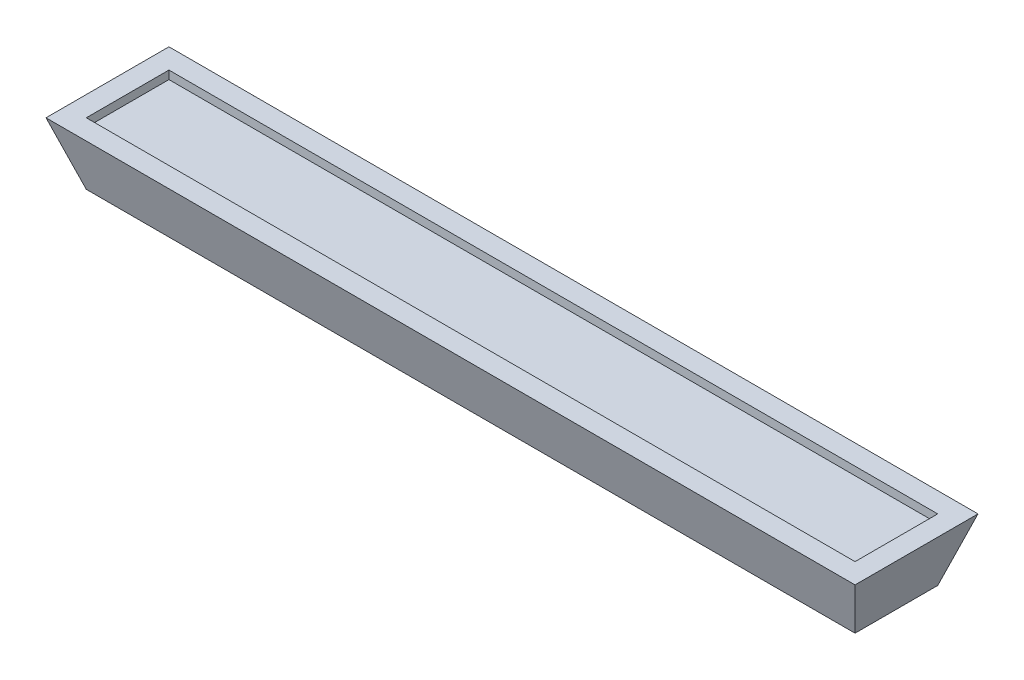
ISO-10303-21;
HEADER;
FILE_DESCRIPTION(('STEP AP214'),'2;1');
FILE_NAME('part.step','',(''),(''),'','','');
FILE_SCHEMA(('AUTOMOTIVE_DESIGN { 1 0 10303 214 1 1 1 1 }'));
ENDSEC;
DATA;
#1=APPLICATION_CONTEXT('core data for automotive mechanical design processes');
#2=APPLICATION_PROTOCOL_DEFINITION('international standard','automotive_design',2000,#1);
#3=PRODUCT_CONTEXT('',#1,'mechanical');
#4=PRODUCT('Part','Part','',(#3));
#5=PRODUCT_RELATED_PRODUCT_CATEGORY('part','',(#4));
#6=PRODUCT_DEFINITION_FORMATION('','',#4);
#7=PRODUCT_DEFINITION_CONTEXT('part definition',#1,'design');
#8=PRODUCT_DEFINITION('design','',#6,#7);
#9=PRODUCT_DEFINITION_SHAPE('','',#8);
#10=(LENGTH_UNIT() NAMED_UNIT(*) SI_UNIT(.MILLI.,.METRE.));
#11=(NAMED_UNIT(*) PLANE_ANGLE_UNIT() SI_UNIT($,.RADIAN.));
#12=(NAMED_UNIT(*) SI_UNIT($,.STERADIAN.) SOLID_ANGLE_UNIT());
#13=UNCERTAINTY_MEASURE_WITH_UNIT(LENGTH_MEASURE(1.E-05),#10,'distance_accuracy_value','');
#14=(GEOMETRIC_REPRESENTATION_CONTEXT(3) GLOBAL_UNCERTAINTY_ASSIGNED_CONTEXT((#13)) GLOBAL_UNIT_ASSIGNED_CONTEXT((#10,
#11,#12)) REPRESENTATION_CONTEXT('',''));
#15=CARTESIAN_POINT('',(0.,0.,0.));
#16=DIRECTION('',(0.,0.,1.));
#17=DIRECTION('',(1.,0.,0.));
#18=AXIS2_PLACEMENT_3D('',#15,#16,#17);
#19=CARTESIAN_POINT('',(93.,0.,-10.));
#20=DIRECTION('',(0.951056516295153,-0.309016994374948,0.));
#21=DIRECTION('',(0.309016994374948,0.951056516295154,0.));
#22=AXIS2_PLACEMENT_3D('',#19,#20,#21);
#23=PLANE('',#22);
#24=DIRECTION('',(0.,0.,-1.));
#25=VECTOR('',#24,1.);
#26=CARTESIAN_POINT('',(93.,0.,-10.));
#27=LINE('',#26,#25);
#28=CARTESIAN_POINT('',(93.,0.,10.));
#29=VERTEX_POINT('',#28);
#30=CARTESIAN_POINT('',(93.,0.,-10.));
#31=VERTEX_POINT('',#30);
#32=EDGE_CURVE('E219',#29,#31,#27,.T.);
#33=ORIENTED_EDGE('',*,*,#32,.T.);
#34=DIRECTION('',(-0.295241808844327,-0.908660854566026,0.295241808844327));
#35=VECTOR('',#34,1.);
#36=CARTESIAN_POINT('',(76.7868030217214,-49.8990894250276,6.21319697827863));
#37=LINE('',#36,#35);
#38=CARTESIAN_POINT('',(97.8737954434936,15.,-14.8737954434936));
#39=VERTEX_POINT('',#38);
#40=EDGE_CURVE('E11',#39,#31,#37,.T.);
#41=ORIENTED_EDGE('',*,*,#40,.F.);
#42=DIRECTION('',(0.,0.,1.));
#43=VECTOR('',#42,1.);
#44=CARTESIAN_POINT('',(97.8737954434936,15.,-10.));
#45=LINE('',#44,#43);
#46=CARTESIAN_POINT('',(97.8737954434936,15.,14.8737954434936));
#47=VERTEX_POINT('',#46);
#48=EDGE_CURVE('E239',#47,#39,#45,.F.);
#49=ORIENTED_EDGE('',*,*,#48,.F.);
#50=DIRECTION('',(-0.295241808844327,-0.908660854566026,-0.295241808844327));
#51=VECTOR('',#50,1.);
#52=CARTESIAN_POINT('',(91.2566454862066,-5.36549348656211,8.2566454862066));
#53=LINE('',#52,#51);
#54=EDGE_CURVE('E241',#47,#29,#53,.T.);
#55=ORIENTED_EDGE('',*,*,#54,.T.);
#56=EDGE_LOOP('',(#33,#41,#49,#55));
#57=FACE_BOUND('',#56,.T.);
#58=ADVANCED_FACE('F39',(#57),#23,.T.);
#59=CARTESIAN_POINT('',(-93.,0.,-10.));
#60=DIRECTION('',(0.,-0.309016994374948,-0.951056516295153));
#61=DIRECTION('',(0.,0.951056516295153,-0.309016994374948));
#62=AXIS2_PLACEMENT_3D('',#59,#60,#61);
#63=PLANE('',#62);
#64=DIRECTION('',(-1.,0.,0.));
#65=VECTOR('',#64,1.);
#66=CARTESIAN_POINT('',(-93.,0.,-10.));
#67=LINE('',#66,#65);
#68=CARTESIAN_POINT('',(-93.,0.,-10.));
#69=VERTEX_POINT('',#68);
#70=EDGE_CURVE('E231',#31,#69,#67,.T.);
#71=ORIENTED_EDGE('',*,*,#70,.T.);
#72=DIRECTION('',(0.295241808844327,-0.908660854566026,0.295241808844327));
#73=VECTOR('',#72,1.);
#74=CARTESIAN_POINT('',(-93.,0.,-10.));
#75=LINE('',#74,#73);
#76=CARTESIAN_POINT('',(-97.8737954434936,15.,-14.8737954434936));
#77=VERTEX_POINT('',#76);
#78=EDGE_CURVE('E49',#77,#69,#75,.T.);
#79=ORIENTED_EDGE('',*,*,#78,.F.);
#80=DIRECTION('',(1.,0.,0.));
#81=VECTOR('',#80,1.);
#82=CARTESIAN_POINT('',(-93.,15.,-14.8737954434936));
#83=LINE('',#82,#81);
#84=EDGE_CURVE('E255',#39,#77,#83,.F.);
#85=ORIENTED_EDGE('',*,*,#84,.F.);
#86=ORIENTED_EDGE('',*,*,#40,.T.);
#87=EDGE_LOOP('',(#71,#79,#85,#86));
#88=FACE_BOUND('',#87,.T.);
#89=ADVANCED_FACE('F41',(#88),#63,.T.);
#90=CARTESIAN_POINT('',(-93.,0.,-10.));
#91=DIRECTION('',(-0.951056516295153,-0.309016994374948,0.));
#92=DIRECTION('',(0.309016994374948,-0.951056516295154,0.));
#93=AXIS2_PLACEMENT_3D('',#90,#91,#92);
#94=PLANE('',#93);
#95=DIRECTION('',(0.,0.,1.));
#96=VECTOR('',#95,1.);
#97=CARTESIAN_POINT('',(-93.,0.,-10.));
#98=LINE('',#97,#96);
#99=CARTESIAN_POINT('',(-93.,0.,10.));
#100=VERTEX_POINT('',#99);
#101=EDGE_CURVE('E234',#69,#100,#98,.T.);
#102=ORIENTED_EDGE('',*,*,#101,.T.);
#103=DIRECTION('',(0.295241808844327,-0.908660854566026,-0.295241808844327));
#104=VECTOR('',#103,1.);
#105=CARTESIAN_POINT('',(-93.,0.,10.));
#106=LINE('',#105,#104);
#107=CARTESIAN_POINT('',(-97.8737954434936,15.,14.8737954434936));
#108=VERTEX_POINT('',#107);
#109=EDGE_CURVE('E245',#108,#100,#106,.T.);
#110=ORIENTED_EDGE('',*,*,#109,.F.);
#111=DIRECTION('',(0.,0.,-1.));
#112=VECTOR('',#111,1.);
#113=CARTESIAN_POINT('',(-97.8737954434936,15.,-10.));
#114=LINE('',#113,#112);
#115=EDGE_CURVE('E257',#77,#108,#114,.F.);
#116=ORIENTED_EDGE('',*,*,#115,.F.);
#117=ORIENTED_EDGE('',*,*,#78,.T.);
#118=EDGE_LOOP('',(#102,#110,#116,#117));
#119=FACE_BOUND('',#118,.T.);
#120=ADVANCED_FACE('F277',(#119),#94,.T.);
#121=CARTESIAN_POINT('',(-93.,0.,10.));
#122=DIRECTION('',(0.,-0.309016994374948,0.951056516295153));
#123=DIRECTION('',(0.,-0.951056516295153,-0.309016994374948));
#124=AXIS2_PLACEMENT_3D('',#121,#122,#123);
#125=PLANE('',#124);
#126=DIRECTION('',(1.,0.,0.));
#127=VECTOR('',#126,1.);
#128=CARTESIAN_POINT('',(-93.,0.,10.));
#129=LINE('',#128,#127);
#130=EDGE_CURVE('E237',#100,#29,#129,.T.);
#131=ORIENTED_EDGE('',*,*,#130,.T.);
#132=ORIENTED_EDGE('',*,*,#54,.F.);
#133=DIRECTION('',(-1.,0.,0.));
#134=VECTOR('',#133,1.);
#135=CARTESIAN_POINT('',(-93.,15.,14.8737954434936));
#136=LINE('',#135,#134);
#137=EDGE_CURVE('E43',#108,#47,#136,.F.);
#138=ORIENTED_EDGE('',*,*,#137,.F.);
#139=ORIENTED_EDGE('',*,*,#109,.T.);
#140=EDGE_LOOP('',(#131,#132,#138,#139));
#141=FACE_BOUND('',#140,.T.);
#142=ADVANCED_FACE('F269',(#141),#125,.T.);
#143=CARTESIAN_POINT('',(0.,15.,0.));
#144=DIRECTION('',(0.,1.,0.));
#145=DIRECTION('',(0.,0.,1.));
#146=AXIS2_PLACEMENT_3D('',#143,#144,#145);
#147=PLANE('',#146);
#148=DIRECTION('',(0.,0.,-1.));
#149=VECTOR('',#148,1.);
#150=CARTESIAN_POINT('',(93.,15.,-10.));
#151=LINE('',#150,#149);
#152=CARTESIAN_POINT('',(93.,15.,10.));
#153=VERTEX_POINT('',#152);
#154=CARTESIAN_POINT('',(93.,15.,-10.));
#155=VERTEX_POINT('',#154);
#156=EDGE_CURVE('E65',#153,#155,#151,.T.);
#157=ORIENTED_EDGE('',*,*,#156,.F.);
#158=DIRECTION('',(1.,0.,0.));
#159=VECTOR('',#158,1.);
#160=CARTESIAN_POINT('',(-93.,15.,10.));
#161=LINE('',#160,#159);
#162=CARTESIAN_POINT('',(-93.,15.,10.));
#163=VERTEX_POINT('',#162);
#164=EDGE_CURVE('E190',#163,#153,#161,.T.);
#165=ORIENTED_EDGE('',*,*,#164,.F.);
#166=DIRECTION('',(0.,0.,1.));
#167=VECTOR('',#166,1.);
#168=CARTESIAN_POINT('',(-93.,15.,-10.));
#169=LINE('',#168,#167);
#170=CARTESIAN_POINT('',(-93.,15.,-10.));
#171=VERTEX_POINT('',#170);
#172=EDGE_CURVE('E209',#171,#163,#169,.T.);
#173=ORIENTED_EDGE('',*,*,#172,.F.);
#174=DIRECTION('',(-1.,0.,0.));
#175=VECTOR('',#174,1.);
#176=CARTESIAN_POINT('',(-93.,15.,-10.));
#177=LINE('',#176,#175);
#178=EDGE_CURVE('E205',#155,#171,#177,.T.);
#179=ORIENTED_EDGE('',*,*,#178,.F.);
#180=EDGE_LOOP('',(#157,#165,#173,#179));
#181=FACE_BOUND('',#180,.T.);
#182=ORIENTED_EDGE('',*,*,#48,.T.);
#183=ORIENTED_EDGE('',*,*,#84,.T.);
#184=ORIENTED_EDGE('',*,*,#115,.T.);
#185=ORIENTED_EDGE('',*,*,#137,.T.);
#186=EDGE_LOOP('',(#182,#183,#184,#185));
#187=FACE_BOUND('',#186,.T.);
#188=ADVANCED_FACE('F265',(#181,#187),#147,.T.);
#189=CARTESIAN_POINT('',(0.,0.,0.));
#190=DIRECTION('',(0.,1.,0.));
#191=DIRECTION('',(0.,0.,1.));
#192=AXIS2_PLACEMENT_3D('',#189,#190,#191);
#193=PLANE('',#192);
#194=DIRECTION('',(-1.,0.,0.));
#195=VECTOR('',#194,1.);
#196=CARTESIAN_POINT('',(-88.5,0.,6.5));
#197=LINE('',#196,#195);
#198=CARTESIAN_POINT('',(88.5,0.,6.5));
#199=VERTEX_POINT('',#198);
#200=CARTESIAN_POINT('',(-88.5,0.,6.5));
#201=VERTEX_POINT('',#200);
#202=EDGE_CURVE('E170',#199,#201,#197,.T.);
#203=ORIENTED_EDGE('',*,*,#202,.F.);
#204=DIRECTION('',(0.,0.,1.));
#205=VECTOR('',#204,1.);
#206=CARTESIAN_POINT('',(88.5,0.,6.5));
#207=LINE('',#206,#205);
#208=CARTESIAN_POINT('',(88.5,0.,-6.5));
#209=VERTEX_POINT('',#208);
#210=EDGE_CURVE('E57',#209,#199,#207,.T.);
#211=ORIENTED_EDGE('',*,*,#210,.F.);
#212=DIRECTION('',(1.,0.,0.));
#213=VECTOR('',#212,1.);
#214=CARTESIAN_POINT('',(-88.5,0.,-6.5));
#215=LINE('',#214,#213);
#216=CARTESIAN_POINT('',(-88.5,0.,-6.5));
#217=VERTEX_POINT('',#216);
#218=EDGE_CURVE('E154',#217,#209,#215,.T.);
#219=ORIENTED_EDGE('',*,*,#218,.F.);
#220=DIRECTION('',(0.,0.,-1.));
#221=VECTOR('',#220,1.);
#222=CARTESIAN_POINT('',(-88.5,0.,6.5));
#223=LINE('',#222,#221);
#224=EDGE_CURVE('E158',#201,#217,#223,.T.);
#225=ORIENTED_EDGE('',*,*,#224,.F.);
#226=EDGE_LOOP('',(#203,#211,#219,#225));
#227=FACE_BOUND('',#226,.T.);
#228=ORIENTED_EDGE('',*,*,#32,.F.);
#229=ORIENTED_EDGE('',*,*,#130,.F.);
#230=ORIENTED_EDGE('',*,*,#101,.F.);
#231=ORIENTED_EDGE('',*,*,#70,.F.);
#232=EDGE_LOOP('',(#228,#229,#230,#231));
#233=FACE_BOUND('',#232,.T.);
#234=ADVANCED_FACE('F279',(#227,#233),#193,.F.);
#235=CARTESIAN_POINT('',(93.,13.,-10.));
#236=DIRECTION('',(1.,0.,0.));
#237=DIRECTION('',(0.,0.,-1.));
#238=AXIS2_PLACEMENT_3D('',#235,#236,#237);
#239=PLANE('',#238);
#240=ORIENTED_EDGE('',*,*,#156,.T.);
#241=DIRECTION('',(0.,1.,0.));
#242=VECTOR('',#241,1.);
#243=CARTESIAN_POINT('',(93.,13.,-10.));
#244=LINE('',#243,#242);
#245=CARTESIAN_POINT('',(93.,13.,-10.));
#246=VERTEX_POINT('',#245);
#247=EDGE_CURVE('E202',#246,#155,#244,.T.);
#248=ORIENTED_EDGE('',*,*,#247,.F.);
#249=DIRECTION('',(0.,0.,-1.));
#250=VECTOR('',#249,1.);
#251=CARTESIAN_POINT('',(93.,13.,-10.));
#252=LINE('',#251,#250);
#253=CARTESIAN_POINT('',(93.,13.,10.));
#254=VERTEX_POINT('',#253);
#255=EDGE_CURVE('E185',#254,#246,#252,.T.);
#256=ORIENTED_EDGE('',*,*,#255,.F.);
#257=DIRECTION('',(0.,1.,0.));
#258=VECTOR('',#257,1.);
#259=CARTESIAN_POINT('',(93.,13.,10.));
#260=LINE('',#259,#258);
#261=EDGE_CURVE('E216',#254,#153,#260,.T.);
#262=ORIENTED_EDGE('',*,*,#261,.T.);
#263=EDGE_LOOP('',(#240,#248,#256,#262));
#264=FACE_BOUND('',#263,.T.);
#265=ADVANCED_FACE('F281',(#264),#239,.F.);
#266=CARTESIAN_POINT('',(-93.,13.,10.));
#267=DIRECTION('',(0.,0.,1.));
#268=DIRECTION('',(1.,0.,0.));
#269=AXIS2_PLACEMENT_3D('',#266,#267,#268);
#270=PLANE('',#269);
#271=ORIENTED_EDGE('',*,*,#164,.T.);
#272=ORIENTED_EDGE('',*,*,#261,.F.);
#273=DIRECTION('',(1.,0.,0.));
#274=VECTOR('',#273,1.);
#275=CARTESIAN_POINT('',(-93.,13.,10.));
#276=LINE('',#275,#274);
#277=CARTESIAN_POINT('',(-93.,13.,10.));
#278=VERTEX_POINT('',#277);
#279=EDGE_CURVE('E198',#278,#254,#276,.T.);
#280=ORIENTED_EDGE('',*,*,#279,.F.);
#281=DIRECTION('',(0.,1.,0.));
#282=VECTOR('',#281,1.);
#283=CARTESIAN_POINT('',(-93.,13.,10.));
#284=LINE('',#283,#282);
#285=EDGE_CURVE('E220',#278,#163,#284,.T.);
#286=ORIENTED_EDGE('',*,*,#285,.T.);
#287=EDGE_LOOP('',(#271,#272,#280,#286));
#288=FACE_BOUND('',#287,.T.);
#289=ADVANCED_FACE('F288',(#288),#270,.F.);
#290=CARTESIAN_POINT('',(-93.,13.,-10.));
#291=DIRECTION('',(-1.,0.,0.));
#292=DIRECTION('',(0.,0.,1.));
#293=AXIS2_PLACEMENT_3D('',#290,#291,#292);
#294=PLANE('',#293);
#295=ORIENTED_EDGE('',*,*,#172,.T.);
#296=ORIENTED_EDGE('',*,*,#285,.F.);
#297=DIRECTION('',(0.,0.,1.));
#298=VECTOR('',#297,1.);
#299=CARTESIAN_POINT('',(-93.,13.,-10.));
#300=LINE('',#299,#298);
#301=CARTESIAN_POINT('',(-93.,13.,-10.));
#302=VERTEX_POINT('',#301);
#303=EDGE_CURVE('E194',#302,#278,#300,.T.);
#304=ORIENTED_EDGE('',*,*,#303,.F.);
#305=DIRECTION('',(0.,1.,0.));
#306=VECTOR('',#305,1.);
#307=CARTESIAN_POINT('',(-93.,13.,-10.));
#308=LINE('',#307,#306);
#309=EDGE_CURVE('E223',#302,#171,#308,.T.);
#310=ORIENTED_EDGE('',*,*,#309,.T.);
#311=EDGE_LOOP('',(#295,#296,#304,#310));
#312=FACE_BOUND('',#311,.T.);
#313=ADVANCED_FACE('F328',(#312),#294,.F.);
#314=CARTESIAN_POINT('',(-93.,13.,-10.));
#315=DIRECTION('',(0.,0.,-1.));
#316=DIRECTION('',(-1.,0.,0.));
#317=AXIS2_PLACEMENT_3D('',#314,#315,#316);
#318=PLANE('',#317);
#319=ORIENTED_EDGE('',*,*,#178,.T.);
#320=ORIENTED_EDGE('',*,*,#309,.F.);
#321=DIRECTION('',(-1.,0.,0.));
#322=VECTOR('',#321,1.);
#323=CARTESIAN_POINT('',(-93.,13.,-10.));
#324=LINE('',#323,#322);
#325=EDGE_CURVE('E189',#246,#302,#324,.T.);
#326=ORIENTED_EDGE('',*,*,#325,.F.);
#327=ORIENTED_EDGE('',*,*,#247,.T.);
#328=EDGE_LOOP('',(#319,#320,#326,#327));
#329=FACE_BOUND('',#328,.T.);
#330=ADVANCED_FACE('F338',(#329),#318,.F.);
#331=CARTESIAN_POINT('',(0.,13.,0.));
#332=DIRECTION('',(0.,1.,0.));
#333=DIRECTION('',(0.,0.,1.));
#334=AXIS2_PLACEMENT_3D('',#331,#332,#333);
#335=PLANE('',#334);
#336=ORIENTED_EDGE('',*,*,#255,.T.);
#337=ORIENTED_EDGE('',*,*,#325,.T.);
#338=ORIENTED_EDGE('',*,*,#303,.T.);
#339=ORIENTED_EDGE('',*,*,#279,.T.);
#340=EDGE_LOOP('',(#336,#337,#338,#339));
#341=FACE_BOUND('',#340,.T.);
#342=ADVANCED_FACE('F348',(#341),#335,.T.);
#343=CARTESIAN_POINT('',(88.5,4.,6.5));
#344=DIRECTION('',(1.,0.,0.));
#345=DIRECTION('',(0.,0.,-1.));
#346=AXIS2_PLACEMENT_3D('',#343,#344,#345);
#347=PLANE('',#346);
#348=ORIENTED_EDGE('',*,*,#210,.T.);
#349=DIRECTION('',(0.,-1.,0.));
#350=VECTOR('',#349,1.);
#351=CARTESIAN_POINT('',(88.5,4.,6.5));
#352=LINE('',#351,#350);
#353=CARTESIAN_POINT('',(88.5,4.,6.5));
#354=VERTEX_POINT('',#353);
#355=EDGE_CURVE('E129',#354,#199,#352,.T.);
#356=ORIENTED_EDGE('',*,*,#355,.F.);
#357=DIRECTION('',(0.,0.,1.));
#358=VECTOR('',#357,1.);
#359=CARTESIAN_POINT('',(88.5,4.,6.5));
#360=LINE('',#359,#358);
#361=CARTESIAN_POINT('',(88.5,4.,-6.5));
#362=VERTEX_POINT('',#361);
#363=EDGE_CURVE('E133',#362,#354,#360,.T.);
#364=ORIENTED_EDGE('',*,*,#363,.F.);
#365=DIRECTION('',(0.,-1.,0.));
#366=VECTOR('',#365,1.);
#367=CARTESIAN_POINT('',(88.5,4.,-6.5));
#368=LINE('',#367,#366);
#369=EDGE_CURVE('E177',#362,#209,#368,.T.);
#370=ORIENTED_EDGE('',*,*,#369,.T.);
#371=EDGE_LOOP('',(#348,#356,#364,#370));
#372=FACE_BOUND('',#371,.T.);
#373=ADVANCED_FACE('F131',(#372),#347,.F.);
#374=CARTESIAN_POINT('',(-88.5,4.,-6.5));
#375=DIRECTION('',(0.,0.,-1.));
#376=DIRECTION('',(-1.,0.,0.));
#377=AXIS2_PLACEMENT_3D('',#374,#375,#376);
#378=PLANE('',#377);
#379=ORIENTED_EDGE('',*,*,#218,.T.);
#380=ORIENTED_EDGE('',*,*,#369,.F.);
#381=DIRECTION('',(1.,0.,0.));
#382=VECTOR('',#381,1.);
#383=CARTESIAN_POINT('',(-88.5,4.,-6.5));
#384=LINE('',#383,#382);
#385=CARTESIAN_POINT('',(-88.5,4.,-6.5));
#386=VERTEX_POINT('',#385);
#387=EDGE_CURVE('E140',#386,#362,#384,.T.);
#388=ORIENTED_EDGE('',*,*,#387,.F.);
#389=DIRECTION('',(0.,-1.,0.));
#390=VECTOR('',#389,1.);
#391=CARTESIAN_POINT('',(-88.5,4.,-6.5));
#392=LINE('',#391,#390);
#393=EDGE_CURVE('E180',#386,#217,#392,.T.);
#394=ORIENTED_EDGE('',*,*,#393,.T.);
#395=EDGE_LOOP('',(#379,#380,#388,#394));
#396=FACE_BOUND('',#395,.T.);
#397=ADVANCED_FACE('F370',(#396),#378,.F.);
#398=CARTESIAN_POINT('',(-88.5,4.,6.5));
#399=DIRECTION('',(-1.,0.,0.));
#400=DIRECTION('',(0.,0.,1.));
#401=AXIS2_PLACEMENT_3D('',#398,#399,#400);
#402=PLANE('',#401);
#403=ORIENTED_EDGE('',*,*,#224,.T.);
#404=ORIENTED_EDGE('',*,*,#393,.F.);
#405=DIRECTION('',(0.,0.,-1.));
#406=VECTOR('',#405,1.);
#407=CARTESIAN_POINT('',(-88.5,4.,6.5));
#408=LINE('',#407,#406);
#409=CARTESIAN_POINT('',(-88.5,4.,6.5));
#410=VERTEX_POINT('',#409);
#411=EDGE_CURVE('E149',#410,#386,#408,.T.);
#412=ORIENTED_EDGE('',*,*,#411,.F.);
#413=DIRECTION('',(0.,-1.,0.));
#414=VECTOR('',#413,1.);
#415=CARTESIAN_POINT('',(-88.5,4.,6.5));
#416=LINE('',#415,#414);
#417=EDGE_CURVE('E139',#410,#201,#416,.T.);
#418=ORIENTED_EDGE('',*,*,#417,.T.);
#419=EDGE_LOOP('',(#403,#404,#412,#418));
#420=FACE_BOUND('',#419,.T.);
#421=ADVANCED_FACE('F379',(#420),#402,.F.);
#422=CARTESIAN_POINT('',(-88.5,4.,6.5));
#423=DIRECTION('',(0.,0.,1.));
#424=DIRECTION('',(1.,0.,0.));
#425=AXIS2_PLACEMENT_3D('',#422,#423,#424);
#426=PLANE('',#425);
#427=ORIENTED_EDGE('',*,*,#202,.T.);
#428=ORIENTED_EDGE('',*,*,#417,.F.);
#429=DIRECTION('',(-1.,0.,0.));
#430=VECTOR('',#429,1.);
#431=CARTESIAN_POINT('',(-88.5,4.,6.5));
#432=LINE('',#431,#430);
#433=EDGE_CURVE('E143',#354,#410,#432,.T.);
#434=ORIENTED_EDGE('',*,*,#433,.F.);
#435=ORIENTED_EDGE('',*,*,#355,.T.);
#436=EDGE_LOOP('',(#427,#428,#434,#435));
#437=FACE_BOUND('',#436,.T.);
#438=ADVANCED_FACE('F144',(#437),#426,.F.);
#439=CARTESIAN_POINT('',(0.,4.,0.));
#440=DIRECTION('',(0.,-1.,0.));
#441=DIRECTION('',(0.,0.,-1.));
#442=AXIS2_PLACEMENT_3D('',#439,#440,#441);
#443=PLANE('',#442);
#444=CARTESIAN_POINT('',(-72.,4.,0.));
#445=DIRECTION('',(0.,-1.,0.));
#446=DIRECTION('',(0.,0.,-1.));
#447=AXIS2_PLACEMENT_3D('',#444,#445,#446);
#448=CIRCLE('',#447,2.75000000000001);
#449=CARTESIAN_POINT('',(-72.,4.,-2.75000000000001));
#450=VERTEX_POINT('',#449);
#451=EDGE_CURVE('E493',#450,#450,#448,.T.);
#452=ORIENTED_EDGE('',*,*,#451,.F.);
#453=EDGE_LOOP('',(#452));
#454=FACE_BOUND('',#453,.T.);
#455=CARTESIAN_POINT('',(-38.,4.,0.));
#456=DIRECTION('',(0.,-1.,0.));
#457=DIRECTION('',(0.,0.,-1.));
#458=AXIS2_PLACEMENT_3D('',#455,#456,#457);
#459=CIRCLE('',#458,2.75);
#460=CARTESIAN_POINT('',(-38.,4.,-2.75));
#461=VERTEX_POINT('',#460);
#462=EDGE_CURVE('E503',#461,#461,#459,.T.);
#463=ORIENTED_EDGE('',*,*,#462,.F.);
#464=EDGE_LOOP('',(#463));
#465=FACE_BOUND('',#464,.T.);
#466=CARTESIAN_POINT('',(38.,4.,0.));
#467=DIRECTION('',(0.,-1.,0.));
#468=DIRECTION('',(0.,0.,-1.));
#469=AXIS2_PLACEMENT_3D('',#466,#467,#468);
#470=CIRCLE('',#469,2.75);
#471=CARTESIAN_POINT('',(38.,4.,-2.75));
#472=VERTEX_POINT('',#471);
#473=EDGE_CURVE('E511',#472,#472,#470,.T.);
#474=ORIENTED_EDGE('',*,*,#473,.F.);
#475=EDGE_LOOP('',(#474));
#476=FACE_BOUND('',#475,.T.);
#477=CARTESIAN_POINT('',(72.,4.,0.));
#478=DIRECTION('',(0.,-1.,0.));
#479=DIRECTION('',(0.,0.,-1.));
#480=AXIS2_PLACEMENT_3D('',#477,#478,#479);
#481=CIRCLE('',#480,2.75000000000001);
#482=CARTESIAN_POINT('',(72.,4.,-2.75000000000001));
#483=VERTEX_POINT('',#482);
#484=EDGE_CURVE('E161',#483,#483,#481,.T.);
#485=ORIENTED_EDGE('',*,*,#484,.F.);
#486=EDGE_LOOP('',(#485));
#487=FACE_BOUND('',#486,.T.);
#488=ORIENTED_EDGE('',*,*,#363,.T.);
#489=ORIENTED_EDGE('',*,*,#433,.T.);
#490=ORIENTED_EDGE('',*,*,#411,.T.);
#491=ORIENTED_EDGE('',*,*,#387,.T.);
#492=EDGE_LOOP('',(#488,#489,#490,#491));
#493=FACE_BOUND('',#492,.T.);
#494=ADVANCED_FACE('F151',(#454,#465,#476,#487,#493),#443,.T.);
#495=CARTESIAN_POINT('',(72.,9.5,0.));
#496=DIRECTION('',(0.,-1.,0.));
#497=DIRECTION('',(0.,0.,-1.));
#498=AXIS2_PLACEMENT_3D('',#495,#496,#497);
#499=CYLINDRICAL_SURFACE('',#498,2.75000000000001);
#500=CARTESIAN_POINT('',(72.,9.5,0.));
#501=DIRECTION('',(0.,-1.,0.));
#502=DIRECTION('',(0.,0.,-1.));
#503=AXIS2_PLACEMENT_3D('',#500,#501,#502);
#504=CIRCLE('',#503,2.75000000000001);
#505=CARTESIAN_POINT('',(72.,9.5,-2.75000000000001));
#506=VERTEX_POINT('',#505);
#507=EDGE_CURVE('E514',#506,#506,#504,.T.);
#508=ORIENTED_EDGE('',*,*,#507,.F.);
#509=EDGE_LOOP('',(#508));
#510=FACE_BOUND('',#509,.T.);
#511=ORIENTED_EDGE('',*,*,#484,.T.);
#512=EDGE_LOOP('',(#511));
#513=FACE_BOUND('',#512,.T.);
#514=ADVANCED_FACE('F406',(#510,#513),#499,.F.);
#515=CARTESIAN_POINT('',(72.,9.5,0.));
#516=DIRECTION('',(0.,-1.,0.));
#517=DIRECTION('',(0.,0.,-1.));
#518=AXIS2_PLACEMENT_3D('',#515,#516,#517);
#519=PLANE('',#518);
#520=ORIENTED_EDGE('',*,*,#507,.T.);
#521=EDGE_LOOP('',(#520));
#522=FACE_BOUND('',#521,.T.);
#523=ADVANCED_FACE('F416',(#522),#519,.T.);
#524=CARTESIAN_POINT('',(38.,9.5,0.));
#525=DIRECTION('',(0.,-1.,0.));
#526=DIRECTION('',(0.,0.,-1.));
#527=AXIS2_PLACEMENT_3D('',#524,#525,#526);
#528=CYLINDRICAL_SURFACE('',#527,2.75);
#529=CARTESIAN_POINT('',(38.,9.5,0.));
#530=DIRECTION('',(0.,-1.,0.));
#531=DIRECTION('',(0.,0.,-1.));
#532=AXIS2_PLACEMENT_3D('',#529,#530,#531);
#533=CIRCLE('',#532,2.75);
#534=CARTESIAN_POINT('',(38.,9.5,-2.75));
#535=VERTEX_POINT('',#534);
#536=EDGE_CURVE('E507',#535,#535,#533,.T.);
#537=ORIENTED_EDGE('',*,*,#536,.F.);
#538=EDGE_LOOP('',(#537));
#539=FACE_BOUND('',#538,.T.);
#540=ORIENTED_EDGE('',*,*,#473,.T.);
#541=EDGE_LOOP('',(#540));
#542=FACE_BOUND('',#541,.T.);
#543=ADVANCED_FACE('F426',(#539,#542),#528,.F.);
#544=CARTESIAN_POINT('',(38.,9.5,0.));
#545=DIRECTION('',(0.,-1.,0.));
#546=DIRECTION('',(0.,0.,-1.));
#547=AXIS2_PLACEMENT_3D('',#544,#545,#546);
#548=PLANE('',#547);
#549=ORIENTED_EDGE('',*,*,#536,.T.);
#550=EDGE_LOOP('',(#549));
#551=FACE_BOUND('',#550,.T.);
#552=ADVANCED_FACE('F436',(#551),#548,.T.);
#553=CARTESIAN_POINT('',(-38.,9.5,0.));
#554=DIRECTION('',(0.,-1.,0.));
#555=DIRECTION('',(0.,0.,-1.));
#556=AXIS2_PLACEMENT_3D('',#553,#554,#555);
#557=CYLINDRICAL_SURFACE('',#556,2.75);
#558=CARTESIAN_POINT('',(-38.,9.5,0.));
#559=DIRECTION('',(0.,-1.,0.));
#560=DIRECTION('',(0.,0.,-1.));
#561=AXIS2_PLACEMENT_3D('',#558,#559,#560);
#562=CIRCLE('',#561,2.75);
#563=CARTESIAN_POINT('',(-38.,9.5,-2.75));
#564=VERTEX_POINT('',#563);
#565=EDGE_CURVE('E497',#564,#564,#562,.T.);
#566=ORIENTED_EDGE('',*,*,#565,.F.);
#567=EDGE_LOOP('',(#566));
#568=FACE_BOUND('',#567,.T.);
#569=ORIENTED_EDGE('',*,*,#462,.T.);
#570=EDGE_LOOP('',(#569));
#571=FACE_BOUND('',#570,.T.);
#572=ADVANCED_FACE('F446',(#568,#571),#557,.F.);
#573=CARTESIAN_POINT('',(-38.,9.5,0.));
#574=DIRECTION('',(0.,-1.,0.));
#575=DIRECTION('',(0.,0.,-1.));
#576=AXIS2_PLACEMENT_3D('',#573,#574,#575);
#577=PLANE('',#576);
#578=ORIENTED_EDGE('',*,*,#565,.T.);
#579=EDGE_LOOP('',(#578));
#580=FACE_BOUND('',#579,.T.);
#581=ADVANCED_FACE('F456',(#580),#577,.T.);
#582=CARTESIAN_POINT('',(-72.,9.5,0.));
#583=DIRECTION('',(0.,-1.,0.));
#584=DIRECTION('',(0.,0.,-1.));
#585=AXIS2_PLACEMENT_3D('',#582,#583,#584);
#586=CYLINDRICAL_SURFACE('',#585,2.75000000000001);
#587=CARTESIAN_POINT('',(-72.,9.5,0.));
#588=DIRECTION('',(0.,-1.,0.));
#589=DIRECTION('',(0.,0.,-1.));
#590=AXIS2_PLACEMENT_3D('',#587,#588,#589);
#591=CIRCLE('',#590,2.75000000000001);
#592=CARTESIAN_POINT('',(-72.,9.5,-2.75000000000001));
#593=VERTEX_POINT('',#592);
#594=EDGE_CURVE('E171',#593,#593,#591,.T.);
#595=ORIENTED_EDGE('',*,*,#594,.F.);
#596=EDGE_LOOP('',(#595));
#597=FACE_BOUND('',#596,.T.);
#598=ORIENTED_EDGE('',*,*,#451,.T.);
#599=EDGE_LOOP('',(#598));
#600=FACE_BOUND('',#599,.T.);
#601=ADVANCED_FACE('F466',(#597,#600),#586,.F.);
#602=CARTESIAN_POINT('',(-72.,9.5,0.));
#603=DIRECTION('',(0.,-1.,0.));
#604=DIRECTION('',(0.,0.,-1.));
#605=AXIS2_PLACEMENT_3D('',#602,#603,#604);
#606=PLANE('',#605);
#607=ORIENTED_EDGE('',*,*,#594,.T.);
#608=EDGE_LOOP('',(#607));
#609=FACE_BOUND('',#608,.T.);
#610=ADVANCED_FACE('F476',(#609),#606,.T.);
#611=CLOSED_SHELL('',(#58,#89,#120,#142,#188,#234,#265,#289,#313,#330,#342,#373,#397,#421,#438,
#494,#514,#523,#543,#552,#572,#581,#601,#610));
#612=MANIFOLD_SOLID_BREP('B2',#611);
#613=ADVANCED_BREP_SHAPE_REPRESENTATION('',(#18,#612),#14);
#614=SHAPE_DEFINITION_REPRESENTATION(#9,#613);
ENDSEC;
END-ISO-10303-21;
